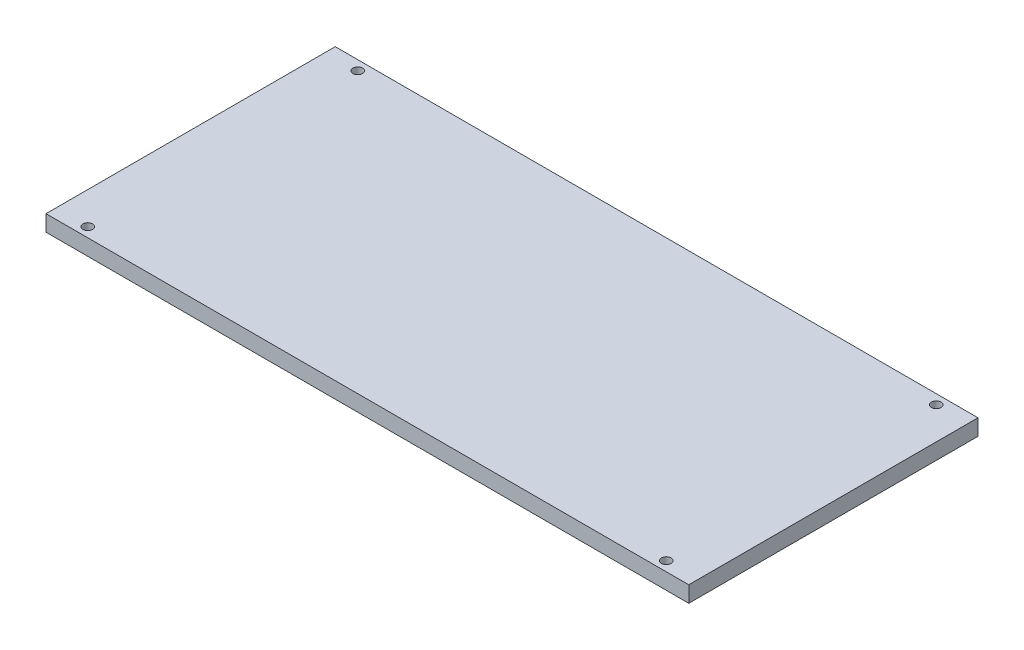
ISO-10303-21;
HEADER;
FILE_DESCRIPTION(('STEP AP214'),'2;1');
FILE_NAME('part.step','',(''),(''),'','','');
FILE_SCHEMA(('AUTOMOTIVE_DESIGN { 1 0 10303 214 1 1 1 1 }'));
ENDSEC;
DATA;
#1=APPLICATION_CONTEXT('core data for automotive mechanical design processes');
#2=APPLICATION_PROTOCOL_DEFINITION('international standard','automotive_design',2000,#1);
#3=PRODUCT_CONTEXT('',#1,'mechanical');
#4=PRODUCT('Part','Part','',(#3));
#5=PRODUCT_RELATED_PRODUCT_CATEGORY('part','',(#4));
#6=PRODUCT_DEFINITION_FORMATION('','',#4);
#7=PRODUCT_DEFINITION_CONTEXT('part definition',#1,'design');
#8=PRODUCT_DEFINITION('design','',#6,#7);
#9=PRODUCT_DEFINITION_SHAPE('','',#8);
#10=(LENGTH_UNIT() NAMED_UNIT(*) SI_UNIT(.MILLI.,.METRE.));
#11=(NAMED_UNIT(*) PLANE_ANGLE_UNIT() SI_UNIT($,.RADIAN.));
#12=(NAMED_UNIT(*) SI_UNIT($,.STERADIAN.) SOLID_ANGLE_UNIT());
#13=UNCERTAINTY_MEASURE_WITH_UNIT(LENGTH_MEASURE(1.E-05),#10,'distance_accuracy_value','');
#14=(GEOMETRIC_REPRESENTATION_CONTEXT(3) GLOBAL_UNCERTAINTY_ASSIGNED_CONTEXT((#13)) GLOBAL_UNIT_ASSIGNED_CONTEXT((#10,
#11,#12)) REPRESENTATION_CONTEXT('',''));
#15=CARTESIAN_POINT('',(0.,0.,0.));
#16=DIRECTION('',(0.,0.,1.));
#17=DIRECTION('',(1.,0.,0.));
#18=AXIS2_PLACEMENT_3D('',#15,#16,#17);
#19=CARTESIAN_POINT('',(0.,5.,0.));
#20=DIRECTION('',(0.,1.,0.));
#21=DIRECTION('',(0.,0.,1.));
#22=AXIS2_PLACEMENT_3D('',#19,#20,#21);
#23=PLANE('',#22);
#24=CARTESIAN_POINT('',(93.9793447196755,5.,9.35784542981103));
#25=DIRECTION('',(0.,1.,0.));
#26=DIRECTION('',(0.,0.,1.));
#27=AXIS2_PLACEMENT_3D('',#24,#25,#26);
#28=CIRCLE('',#27,1.5);
#29=CARTESIAN_POINT('',(93.9793447196755,5.,10.857845429811));
#30=VERTEX_POINT('',#29);
#31=EDGE_CURVE('E121',#30,#30,#28,.T.);
#32=ORIENTED_EDGE('',*,*,#31,.F.);
#33=EDGE_LOOP('',(#32));
#34=FACE_BOUND('',#33,.T.);
#35=CARTESIAN_POINT('',(-86.0206552803245,5.,9.35784542981103));
#36=DIRECTION('',(0.,1.,0.));
#37=DIRECTION('',(0.,0.,1.));
#38=AXIS2_PLACEMENT_3D('',#35,#36,#37);
#39=CIRCLE('',#38,1.5);
#40=CARTESIAN_POINT('',(-86.0206552803245,5.,10.857845429811));
#41=VERTEX_POINT('',#40);
#42=EDGE_CURVE('E100',#41,#41,#39,.T.);
#43=ORIENTED_EDGE('',*,*,#42,.F.);
#44=EDGE_LOOP('',(#43));
#45=FACE_BOUND('',#44,.T.);
#46=DIRECTION('',(0.,0.,1.));
#47=VECTOR('',#46,1.);
#48=CARTESIAN_POINT('',(-96.0206552803245,5.,6.35784542981103));
#49=LINE('',#48,#47);
#50=CARTESIAN_POINT('',(-96.0206552803245,5.,6.35784542981103));
#51=VERTEX_POINT('',#50);
#52=CARTESIAN_POINT('',(-96.0206552803245,5.,96.357845429811));
#53=VERTEX_POINT('',#52);
#54=EDGE_CURVE('E85',#51,#53,#49,.T.);
#55=ORIENTED_EDGE('',*,*,#54,.T.);
#56=DIRECTION('',(1.,0.,0.));
#57=VECTOR('',#56,1.);
#58=CARTESIAN_POINT('',(-96.0206552803245,5.,96.357845429811));
#59=LINE('',#58,#57);
#60=CARTESIAN_POINT('',(103.979344719675,5.,96.357845429811));
#61=VERTEX_POINT('',#60);
#62=EDGE_CURVE('E80',#53,#61,#59,.T.);
#63=ORIENTED_EDGE('',*,*,#62,.T.);
#64=DIRECTION('',(0.,0.,-1.));
#65=VECTOR('',#64,1.);
#66=CARTESIAN_POINT('',(103.979344719675,5.,6.35784542981103));
#67=LINE('',#66,#65);
#68=CARTESIAN_POINT('',(103.979344719675,5.,6.35784542981103));
#69=VERTEX_POINT('',#68);
#70=EDGE_CURVE('E83',#61,#69,#67,.T.);
#71=ORIENTED_EDGE('',*,*,#70,.T.);
#72=DIRECTION('',(-1.,0.,0.));
#73=VECTOR('',#72,1.);
#74=CARTESIAN_POINT('',(-96.0206552803245,5.,6.35784542981103));
#75=LINE('',#74,#73);
#76=EDGE_CURVE('E50',#69,#51,#75,.T.);
#77=ORIENTED_EDGE('',*,*,#76,.T.);
#78=EDGE_LOOP('',(#55,#63,#71,#77));
#79=FACE_BOUND('',#78,.T.);
#80=CARTESIAN_POINT('',(-86.0206552803245,5.,93.357845429811));
#81=DIRECTION('',(0.,1.,0.));
#82=DIRECTION('',(0.,0.,1.));
#83=AXIS2_PLACEMENT_3D('',#80,#81,#82);
#84=CIRCLE('',#83,1.5);
#85=CARTESIAN_POINT('',(-86.0206552803245,5.,94.857845429811));
#86=VERTEX_POINT('',#85);
#87=EDGE_CURVE('E115',#86,#86,#84,.T.);
#88=ORIENTED_EDGE('',*,*,#87,.F.);
#89=EDGE_LOOP('',(#88));
#90=FACE_BOUND('',#89,.T.);
#91=CARTESIAN_POINT('',(93.9793447196755,5.,93.357845429811));
#92=DIRECTION('',(0.,1.,0.));
#93=DIRECTION('',(0.,0.,1.));
#94=AXIS2_PLACEMENT_3D('',#91,#92,#93);
#95=CIRCLE('',#94,1.5);
#96=CARTESIAN_POINT('',(93.9793447196755,5.,94.857845429811));
#97=VERTEX_POINT('',#96);
#98=EDGE_CURVE('E127',#97,#97,#95,.T.);
#99=ORIENTED_EDGE('',*,*,#98,.F.);
#100=EDGE_LOOP('',(#99));
#101=FACE_BOUND('',#100,.T.);
#102=ADVANCED_FACE('F33',(#34,#45,#79,#90,#101),#23,.T.);
#103=CARTESIAN_POINT('',(0.,0.,0.));
#104=DIRECTION('',(0.,1.,0.));
#105=DIRECTION('',(0.,0.,1.));
#106=AXIS2_PLACEMENT_3D('',#103,#104,#105);
#107=PLANE('',#106);
#108=DIRECTION('',(0.,0.,1.));
#109=VECTOR('',#108,1.);
#110=CARTESIAN_POINT('',(-96.0206552803245,0.,6.35784542981103));
#111=LINE('',#110,#109);
#112=CARTESIAN_POINT('',(-96.0206552803245,0.,6.35784542981103));
#113=VERTEX_POINT('',#112);
#114=CARTESIAN_POINT('',(-96.0206552803245,0.,96.357845429811));
#115=VERTEX_POINT('',#114);
#116=EDGE_CURVE('E97',#113,#115,#111,.T.);
#117=ORIENTED_EDGE('',*,*,#116,.F.);
#118=DIRECTION('',(-1.,0.,0.));
#119=VECTOR('',#118,1.);
#120=CARTESIAN_POINT('',(-96.0206552803245,0.,6.35784542981103));
#121=LINE('',#120,#119);
#122=CARTESIAN_POINT('',(103.979344719675,0.,6.35784542981103));
#123=VERTEX_POINT('',#122);
#124=EDGE_CURVE('E73',#123,#113,#121,.T.);
#125=ORIENTED_EDGE('',*,*,#124,.F.);
#126=DIRECTION('',(0.,0.,-1.));
#127=VECTOR('',#126,1.);
#128=CARTESIAN_POINT('',(103.979344719675,0.,6.35784542981103));
#129=LINE('',#128,#127);
#130=CARTESIAN_POINT('',(103.979344719675,0.,96.357845429811));
#131=VERTEX_POINT('',#130);
#132=EDGE_CURVE('E67',#131,#123,#129,.T.);
#133=ORIENTED_EDGE('',*,*,#132,.F.);
#134=DIRECTION('',(1.,0.,0.));
#135=VECTOR('',#134,1.);
#136=CARTESIAN_POINT('',(-96.0206552803245,0.,96.357845429811));
#137=LINE('',#136,#135);
#138=EDGE_CURVE('E89',#115,#131,#137,.T.);
#139=ORIENTED_EDGE('',*,*,#138,.F.);
#140=EDGE_LOOP('',(#117,#125,#133,#139));
#141=FACE_BOUND('',#140,.T.);
#142=CARTESIAN_POINT('',(-86.0206552803245,0.,9.35784542981103));
#143=DIRECTION('',(0.,1.,0.));
#144=DIRECTION('',(0.,0.,1.));
#145=AXIS2_PLACEMENT_3D('',#142,#143,#144);
#146=CIRCLE('',#145,1.5);
#147=CARTESIAN_POINT('',(-86.0206552803245,0.,10.857845429811));
#148=VERTEX_POINT('',#147);
#149=EDGE_CURVE('E112',#148,#148,#146,.T.);
#150=ORIENTED_EDGE('',*,*,#149,.T.);
#151=EDGE_LOOP('',(#150));
#152=FACE_BOUND('',#151,.T.);
#153=CARTESIAN_POINT('',(-86.0206552803245,0.,93.357845429811));
#154=DIRECTION('',(0.,1.,0.));
#155=DIRECTION('',(0.,0.,1.));
#156=AXIS2_PLACEMENT_3D('',#153,#154,#155);
#157=CIRCLE('',#156,1.5);
#158=CARTESIAN_POINT('',(-86.0206552803245,0.,94.857845429811));
#159=VERTEX_POINT('',#158);
#160=EDGE_CURVE('E118',#159,#159,#157,.T.);
#161=ORIENTED_EDGE('',*,*,#160,.T.);
#162=EDGE_LOOP('',(#161));
#163=FACE_BOUND('',#162,.T.);
#164=CARTESIAN_POINT('',(93.9793447196755,0.,9.35784542981103));
#165=DIRECTION('',(0.,1.,0.));
#166=DIRECTION('',(0.,0.,1.));
#167=AXIS2_PLACEMENT_3D('',#164,#165,#166);
#168=CIRCLE('',#167,1.5);
#169=CARTESIAN_POINT('',(93.9793447196755,0.,10.857845429811));
#170=VERTEX_POINT('',#169);
#171=EDGE_CURVE('E124',#170,#170,#168,.T.);
#172=ORIENTED_EDGE('',*,*,#171,.T.);
#173=EDGE_LOOP('',(#172));
#174=FACE_BOUND('',#173,.T.);
#175=CARTESIAN_POINT('',(93.9793447196755,0.,93.357845429811));
#176=DIRECTION('',(0.,1.,0.));
#177=DIRECTION('',(0.,0.,1.));
#178=AXIS2_PLACEMENT_3D('',#175,#176,#177);
#179=CIRCLE('',#178,1.5);
#180=CARTESIAN_POINT('',(93.9793447196755,0.,94.857845429811));
#181=VERTEX_POINT('',#180);
#182=EDGE_CURVE('E130',#181,#181,#179,.T.);
#183=ORIENTED_EDGE('',*,*,#182,.T.);
#184=EDGE_LOOP('',(#183));
#185=FACE_BOUND('',#184,.T.);
#186=ADVANCED_FACE('F108',(#141,#152,#163,#174,#185),#107,.F.);
#187=CARTESIAN_POINT('',(-96.0206552803245,5.,6.35784542981103));
#188=DIRECTION('',(1.,0.,0.));
#189=DIRECTION('',(0.,0.,-1.));
#190=AXIS2_PLACEMENT_3D('',#187,#188,#189);
#191=PLANE('',#190);
#192=ORIENTED_EDGE('',*,*,#116,.T.);
#193=DIRECTION('',(0.,-1.,0.));
#194=VECTOR('',#193,1.);
#195=CARTESIAN_POINT('',(-96.0206552803245,5.,96.357845429811));
#196=LINE('',#195,#194);
#197=EDGE_CURVE('E11',#53,#115,#196,.T.);
#198=ORIENTED_EDGE('',*,*,#197,.F.);
#199=ORIENTED_EDGE('',*,*,#54,.F.);
#200=DIRECTION('',(0.,-1.,0.));
#201=VECTOR('',#200,1.);
#202=CARTESIAN_POINT('',(-96.0206552803245,5.,6.35784542981103));
#203=LINE('',#202,#201);
#204=EDGE_CURVE('E93',#51,#113,#203,.T.);
#205=ORIENTED_EDGE('',*,*,#204,.T.);
#206=EDGE_LOOP('',(#192,#198,#199,#205));
#207=FACE_BOUND('',#206,.T.);
#208=ADVANCED_FACE('F35',(#207),#191,.F.);
#209=CARTESIAN_POINT('',(-96.0206552803245,5.,96.357845429811));
#210=DIRECTION('',(0.,0.,-1.));
#211=DIRECTION('',(-1.,0.,0.));
#212=AXIS2_PLACEMENT_3D('',#209,#210,#211);
#213=PLANE('',#212);
#214=ORIENTED_EDGE('',*,*,#138,.T.);
#215=DIRECTION('',(0.,-1.,0.));
#216=VECTOR('',#215,1.);
#217=CARTESIAN_POINT('',(103.979344719675,5.,96.357845429811));
#218=LINE('',#217,#216);
#219=EDGE_CURVE('E42',#61,#131,#218,.T.);
#220=ORIENTED_EDGE('',*,*,#219,.F.);
#221=ORIENTED_EDGE('',*,*,#62,.F.);
#222=ORIENTED_EDGE('',*,*,#197,.T.);
#223=EDGE_LOOP('',(#214,#220,#221,#222));
#224=FACE_BOUND('',#223,.T.);
#225=ADVANCED_FACE('F88',(#224),#213,.F.);
#226=CARTESIAN_POINT('',(103.979344719675,5.,6.35784542981103));
#227=DIRECTION('',(-1.,0.,0.));
#228=DIRECTION('',(0.,0.,1.));
#229=AXIS2_PLACEMENT_3D('',#226,#227,#228);
#230=PLANE('',#229);
#231=ORIENTED_EDGE('',*,*,#132,.T.);
#232=DIRECTION('',(0.,-1.,0.));
#233=VECTOR('',#232,1.);
#234=CARTESIAN_POINT('',(103.979344719675,5.,6.35784542981103));
#235=LINE('',#234,#233);
#236=EDGE_CURVE('E90',#69,#123,#235,.T.);
#237=ORIENTED_EDGE('',*,*,#236,.F.);
#238=ORIENTED_EDGE('',*,*,#70,.F.);
#239=ORIENTED_EDGE('',*,*,#219,.T.);
#240=EDGE_LOOP('',(#231,#237,#238,#239));
#241=FACE_BOUND('',#240,.T.);
#242=ADVANCED_FACE('F91',(#241),#230,.F.);
#243=CARTESIAN_POINT('',(-96.0206552803245,5.,6.35784542981103));
#244=DIRECTION('',(0.,0.,1.));
#245=DIRECTION('',(1.,0.,0.));
#246=AXIS2_PLACEMENT_3D('',#243,#244,#245);
#247=PLANE('',#246);
#248=ORIENTED_EDGE('',*,*,#124,.T.);
#249=ORIENTED_EDGE('',*,*,#204,.F.);
#250=ORIENTED_EDGE('',*,*,#76,.F.);
#251=ORIENTED_EDGE('',*,*,#236,.T.);
#252=EDGE_LOOP('',(#248,#249,#250,#251));
#253=FACE_BOUND('',#252,.T.);
#254=ADVANCED_FACE('F105',(#253),#247,.F.);
#255=CARTESIAN_POINT('',(-86.0206552803245,5.,9.35784542981103));
#256=DIRECTION('',(0.,-1.,0.));
#257=DIRECTION('',(0.,0.,-1.));
#258=AXIS2_PLACEMENT_3D('',#255,#256,#257);
#259=CYLINDRICAL_SURFACE('',#258,1.5);
#260=ORIENTED_EDGE('',*,*,#42,.T.);
#261=EDGE_LOOP('',(#260));
#262=FACE_BOUND('',#261,.T.);
#263=ORIENTED_EDGE('',*,*,#149,.F.);
#264=EDGE_LOOP('',(#263));
#265=FACE_BOUND('',#264,.T.);
#266=ADVANCED_FACE('F149',(#262,#265),#259,.F.);
#267=CARTESIAN_POINT('',(-86.0206552803245,5.,93.357845429811));
#268=DIRECTION('',(0.,-1.,0.));
#269=DIRECTION('',(0.,0.,-1.));
#270=AXIS2_PLACEMENT_3D('',#267,#268,#269);
#271=CYLINDRICAL_SURFACE('',#270,1.5);
#272=ORIENTED_EDGE('',*,*,#87,.T.);
#273=EDGE_LOOP('',(#272));
#274=FACE_BOUND('',#273,.T.);
#275=ORIENTED_EDGE('',*,*,#160,.F.);
#276=EDGE_LOOP('',(#275));
#277=FACE_BOUND('',#276,.T.);
#278=ADVANCED_FACE('F195',(#274,#277),#271,.F.);
#279=CARTESIAN_POINT('',(93.9793447196755,5.,9.35784542981103));
#280=DIRECTION('',(0.,-1.,0.));
#281=DIRECTION('',(0.,0.,-1.));
#282=AXIS2_PLACEMENT_3D('',#279,#280,#281);
#283=CYLINDRICAL_SURFACE('',#282,1.5);
#284=ORIENTED_EDGE('',*,*,#31,.T.);
#285=EDGE_LOOP('',(#284));
#286=FACE_BOUND('',#285,.T.);
#287=ORIENTED_EDGE('',*,*,#171,.F.);
#288=EDGE_LOOP('',(#287));
#289=FACE_BOUND('',#288,.T.);
#290=ADVANCED_FACE('F203',(#286,#289),#283,.F.);
#291=CARTESIAN_POINT('',(93.9793447196755,5.,93.357845429811));
#292=DIRECTION('',(0.,-1.,0.));
#293=DIRECTION('',(0.,0.,-1.));
#294=AXIS2_PLACEMENT_3D('',#291,#292,#293);
#295=CYLINDRICAL_SURFACE('',#294,1.5);
#296=ORIENTED_EDGE('',*,*,#98,.T.);
#297=EDGE_LOOP('',(#296));
#298=FACE_BOUND('',#297,.T.);
#299=ORIENTED_EDGE('',*,*,#182,.F.);
#300=EDGE_LOOP('',(#299));
#301=FACE_BOUND('',#300,.T.);
#302=ADVANCED_FACE('F136',(#298,#301),#295,.F.);
#303=CLOSED_SHELL('',(#102,#186,#208,#225,#242,#254,#266,#278,#290,#302));
#304=MANIFOLD_SOLID_BREP('B2',#303);
#305=ADVANCED_BREP_SHAPE_REPRESENTATION('',(#18,#304),#14);
#306=SHAPE_DEFINITION_REPRESENTATION(#9,#305);
ENDSEC;
END-ISO-10303-21;
